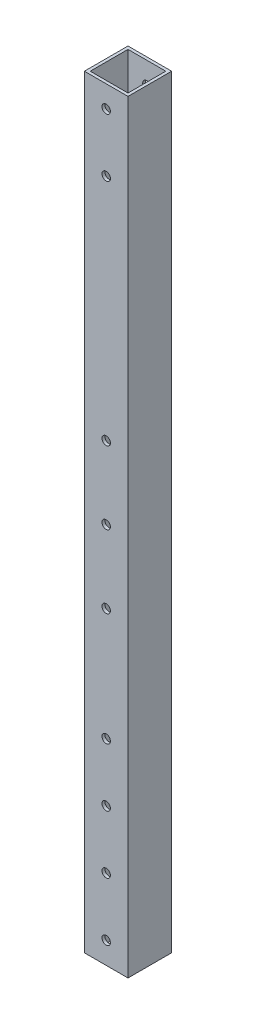
ISO-10303-21;
HEADER;
FILE_DESCRIPTION(('STEP AP214'),'2;1');
FILE_NAME('part.step','',(''),(''),'','','');
FILE_SCHEMA(('AUTOMOTIVE_DESIGN { 1 0 10303 214 1 1 1 1 }'));
ENDSEC;
DATA;
#1=APPLICATION_CONTEXT('core data for automotive mechanical design processes');
#2=APPLICATION_PROTOCOL_DEFINITION('international standard','automotive_design',2000,#1);
#3=PRODUCT_CONTEXT('',#1,'mechanical');
#4=PRODUCT('Part','Part','',(#3));
#5=PRODUCT_RELATED_PRODUCT_CATEGORY('part','',(#4));
#6=PRODUCT_DEFINITION_FORMATION('','',#4);
#7=PRODUCT_DEFINITION_CONTEXT('part definition',#1,'design');
#8=PRODUCT_DEFINITION('design','',#6,#7);
#9=PRODUCT_DEFINITION_SHAPE('','',#8);
#10=(LENGTH_UNIT() NAMED_UNIT(*) SI_UNIT(.MILLI.,.METRE.));
#11=(NAMED_UNIT(*) PLANE_ANGLE_UNIT() SI_UNIT($,.RADIAN.));
#12=(NAMED_UNIT(*) SI_UNIT($,.STERADIAN.) SOLID_ANGLE_UNIT());
#13=UNCERTAINTY_MEASURE_WITH_UNIT(LENGTH_MEASURE(1.E-05),#10,'distance_accuracy_value','');
#14=(GEOMETRIC_REPRESENTATION_CONTEXT(3) GLOBAL_UNCERTAINTY_ASSIGNED_CONTEXT((#13)) GLOBAL_UNIT_ASSIGNED_CONTEXT((#10,
#11,#12)) REPRESENTATION_CONTEXT('',''));
#15=CARTESIAN_POINT('',(0.,0.,0.));
#16=DIRECTION('',(0.,0.,1.));
#17=DIRECTION('',(1.,0.,0.));
#18=AXIS2_PLACEMENT_3D('',#15,#16,#17);
#19=CARTESIAN_POINT('',(0.,262.5,0.));
#20=DIRECTION('',(0.,1.,0.));
#21=DIRECTION('',(0.,0.,1.));
#22=AXIS2_PLACEMENT_3D('',#19,#20,#21);
#23=PLANE('',#22);
#24=DIRECTION('',(0.,0.,-1.));
#25=VECTOR('',#24,1.);
#26=CARTESIAN_POINT('',(7.5,262.5,7.5));
#27=LINE('',#26,#25);
#28=CARTESIAN_POINT('',(7.5,262.5,7.5));
#29=VERTEX_POINT('',#28);
#30=CARTESIAN_POINT('',(7.5,262.5,-7.5));
#31=VERTEX_POINT('',#30);
#32=EDGE_CURVE('E171',#29,#31,#27,.T.);
#33=ORIENTED_EDGE('',*,*,#32,.T.);
#34=DIRECTION('',(-1.,0.,0.));
#35=VECTOR('',#34,1.);
#36=CARTESIAN_POINT('',(-7.5,262.5,-7.5));
#37=LINE('',#36,#35);
#38=CARTESIAN_POINT('',(-7.5,262.5,-7.5));
#39=VERTEX_POINT('',#38);
#40=EDGE_CURVE('E174',#31,#39,#37,.T.);
#41=ORIENTED_EDGE('',*,*,#40,.T.);
#42=DIRECTION('',(0.,0.,1.));
#43=VECTOR('',#42,1.);
#44=CARTESIAN_POINT('',(-7.5,262.5,7.5));
#45=LINE('',#44,#43);
#46=CARTESIAN_POINT('',(-7.5,262.5,7.5));
#47=VERTEX_POINT('',#46);
#48=EDGE_CURVE('E177',#39,#47,#45,.T.);
#49=ORIENTED_EDGE('',*,*,#48,.T.);
#50=DIRECTION('',(1.,0.,0.));
#51=VECTOR('',#50,1.);
#52=CARTESIAN_POINT('',(-7.5,262.5,7.5));
#53=LINE('',#52,#51);
#54=EDGE_CURVE('E179',#47,#29,#53,.T.);
#55=ORIENTED_EDGE('',*,*,#54,.T.);
#56=EDGE_LOOP('',(#33,#41,#49,#55));
#57=FACE_BOUND('',#56,.T.);
#58=DIRECTION('',(-1.,0.,0.));
#59=VECTOR('',#58,1.);
#60=CARTESIAN_POINT('',(0.,262.5,-6.5));
#61=LINE('',#60,#59);
#62=CARTESIAN_POINT('',(6.5,262.5,-6.5));
#63=VERTEX_POINT('',#62);
#64=CARTESIAN_POINT('',(-6.5,262.5,-6.5));
#65=VERTEX_POINT('',#64);
#66=EDGE_CURVE('E141',#63,#65,#61,.T.);
#67=ORIENTED_EDGE('',*,*,#66,.F.);
#68=DIRECTION('',(0.,0.,-1.));
#69=VECTOR('',#68,1.);
#70=CARTESIAN_POINT('',(6.5,262.5,0.));
#71=LINE('',#70,#69);
#72=CARTESIAN_POINT('',(6.5,262.5,6.5));
#73=VERTEX_POINT('',#72);
#74=EDGE_CURVE('E133',#73,#63,#71,.T.);
#75=ORIENTED_EDGE('',*,*,#74,.F.);
#76=DIRECTION('',(1.,0.,0.));
#77=VECTOR('',#76,1.);
#78=CARTESIAN_POINT('',(0.,262.5,6.5));
#79=LINE('',#78,#77);
#80=CARTESIAN_POINT('',(-6.5,262.5,6.5));
#81=VERTEX_POINT('',#80);
#82=EDGE_CURVE('E155',#81,#73,#79,.T.);
#83=ORIENTED_EDGE('',*,*,#82,.F.);
#84=DIRECTION('',(0.,0.,1.));
#85=VECTOR('',#84,1.);
#86=CARTESIAN_POINT('',(-6.5,262.5,0.));
#87=LINE('',#86,#85);
#88=EDGE_CURVE('E153',#65,#81,#87,.T.);
#89=ORIENTED_EDGE('',*,*,#88,.F.);
#90=EDGE_LOOP('',(#67,#75,#83,#89));
#91=FACE_BOUND('',#90,.T.);
#92=ADVANCED_FACE('F66',(#57,#91),#23,.T.);
#93=CARTESIAN_POINT('',(0.,0.,0.));
#94=DIRECTION('',(0.,1.,0.));
#95=DIRECTION('',(0.,0.,1.));
#96=AXIS2_PLACEMENT_3D('',#93,#94,#95);
#97=PLANE('',#96);
#98=DIRECTION('',(0.,0.,-1.));
#99=VECTOR('',#98,1.);
#100=CARTESIAN_POINT('',(7.5,0.,7.5));
#101=LINE('',#100,#99);
#102=CARTESIAN_POINT('',(7.5,0.,7.5));
#103=VERTEX_POINT('',#102);
#104=CARTESIAN_POINT('',(7.5,0.,-7.5));
#105=VERTEX_POINT('',#104);
#106=EDGE_CURVE('E149',#103,#105,#101,.T.);
#107=ORIENTED_EDGE('',*,*,#106,.F.);
#108=DIRECTION('',(1.,0.,0.));
#109=VECTOR('',#108,1.);
#110=CARTESIAN_POINT('',(-7.5,0.,7.5));
#111=LINE('',#110,#109);
#112=CARTESIAN_POINT('',(-7.5,0.,7.5));
#113=VERTEX_POINT('',#112);
#114=EDGE_CURVE('E175',#113,#103,#111,.T.);
#115=ORIENTED_EDGE('',*,*,#114,.F.);
#116=DIRECTION('',(0.,0.,1.));
#117=VECTOR('',#116,1.);
#118=CARTESIAN_POINT('',(-7.5,0.,7.5));
#119=LINE('',#118,#117);
#120=CARTESIAN_POINT('',(-7.5,0.,-7.5));
#121=VERTEX_POINT('',#120);
#122=EDGE_CURVE('E186',#121,#113,#119,.T.);
#123=ORIENTED_EDGE('',*,*,#122,.F.);
#124=DIRECTION('',(-1.,0.,0.));
#125=VECTOR('',#124,1.);
#126=CARTESIAN_POINT('',(-7.5,0.,-7.5));
#127=LINE('',#126,#125);
#128=EDGE_CURVE('E184',#105,#121,#127,.T.);
#129=ORIENTED_EDGE('',*,*,#128,.F.);
#130=EDGE_LOOP('',(#107,#115,#123,#129));
#131=FACE_BOUND('',#130,.T.);
#132=DIRECTION('',(0.,0.,-1.));
#133=VECTOR('',#132,1.);
#134=CARTESIAN_POINT('',(6.5,0.,0.));
#135=LINE('',#134,#133);
#136=CARTESIAN_POINT('',(6.5,0.,6.5));
#137=VERTEX_POINT('',#136);
#138=CARTESIAN_POINT('',(6.5,0.,-6.5));
#139=VERTEX_POINT('',#138);
#140=EDGE_CURVE('E91',#137,#139,#135,.T.);
#141=ORIENTED_EDGE('',*,*,#140,.T.);
#142=DIRECTION('',(-1.,0.,0.));
#143=VECTOR('',#142,1.);
#144=CARTESIAN_POINT('',(0.,0.,-6.5));
#145=LINE('',#144,#143);
#146=CARTESIAN_POINT('',(-6.5,0.,-6.5));
#147=VERTEX_POINT('',#146);
#148=EDGE_CURVE('E148',#139,#147,#145,.T.);
#149=ORIENTED_EDGE('',*,*,#148,.T.);
#150=DIRECTION('',(0.,0.,1.));
#151=VECTOR('',#150,1.);
#152=CARTESIAN_POINT('',(-6.5,0.,0.));
#153=LINE('',#152,#151);
#154=CARTESIAN_POINT('',(-6.5,0.,6.5));
#155=VERTEX_POINT('',#154);
#156=EDGE_CURVE('E163',#147,#155,#153,.T.);
#157=ORIENTED_EDGE('',*,*,#156,.T.);
#158=DIRECTION('',(1.,0.,0.));
#159=VECTOR('',#158,1.);
#160=CARTESIAN_POINT('',(0.,0.,6.5));
#161=LINE('',#160,#159);
#162=EDGE_CURVE('E142',#155,#137,#161,.T.);
#163=ORIENTED_EDGE('',*,*,#162,.T.);
#164=EDGE_LOOP('',(#141,#149,#157,#163));
#165=FACE_BOUND('',#164,.T.);
#166=ADVANCED_FACE('F268',(#131,#165),#97,.F.);
#167=CARTESIAN_POINT('',(7.5,262.5,7.5));
#168=DIRECTION('',(-1.,0.,0.));
#169=DIRECTION('',(0.,0.,1.));
#170=AXIS2_PLACEMENT_3D('',#167,#168,#169);
#171=PLANE('',#170);
#172=ORIENTED_EDGE('',*,*,#106,.T.);
#173=DIRECTION('',(0.,-1.,0.));
#174=VECTOR('',#173,1.);
#175=CARTESIAN_POINT('',(7.5,262.5,-7.5));
#176=LINE('',#175,#174);
#177=EDGE_CURVE('E12',#31,#105,#176,.T.);
#178=ORIENTED_EDGE('',*,*,#177,.F.);
#179=ORIENTED_EDGE('',*,*,#32,.F.);
#180=DIRECTION('',(0.,-1.,0.));
#181=VECTOR('',#180,1.);
#182=CARTESIAN_POINT('',(7.5,262.5,7.5));
#183=LINE('',#182,#181);
#184=EDGE_CURVE('E181',#29,#103,#183,.T.);
#185=ORIENTED_EDGE('',*,*,#184,.T.);
#186=EDGE_LOOP('',(#172,#178,#179,#185));
#187=FACE_BOUND('',#186,.T.);
#188=ADVANCED_FACE('F68',(#187),#171,.F.);
#189=CARTESIAN_POINT('',(-7.5,262.5,-7.5));
#190=DIRECTION('',(0.,0.,1.));
#191=DIRECTION('',(1.,0.,0.));
#192=AXIS2_PLACEMENT_3D('',#189,#190,#191);
#193=PLANE('',#192);
#194=CARTESIAN_POINT('',(0.,7.5,-7.5));
#195=DIRECTION('',(0.,0.,1.));
#196=DIRECTION('',(1.,0.,0.));
#197=AXIS2_PLACEMENT_3D('',#194,#195,#196);
#198=CIRCLE('',#197,1.45);
#199=CARTESIAN_POINT('',(1.45,7.5,-7.5));
#200=VERTEX_POINT('',#199);
#201=EDGE_CURVE('E200',#200,#200,#198,.T.);
#202=ORIENTED_EDGE('',*,*,#201,.T.);
#203=EDGE_LOOP('',(#202));
#204=FACE_BOUND('',#203,.T.);
#205=CARTESIAN_POINT('',(0.,67.5,-7.5));
#206=DIRECTION('',(0.,0.,1.));
#207=DIRECTION('',(1.,0.,0.));
#208=AXIS2_PLACEMENT_3D('',#205,#206,#207);
#209=CIRCLE('',#208,1.45000000000001);
#210=CARTESIAN_POINT('',(1.45000000000001,67.5,-7.5));
#211=VERTEX_POINT('',#210);
#212=EDGE_CURVE('E308',#211,#211,#209,.T.);
#213=ORIENTED_EDGE('',*,*,#212,.T.);
#214=EDGE_LOOP('',(#213));
#215=FACE_BOUND('',#214,.T.);
#216=CARTESIAN_POINT('',(0.,47.5,-7.5));
#217=DIRECTION('',(0.,0.,1.));
#218=DIRECTION('',(1.,0.,0.));
#219=AXIS2_PLACEMENT_3D('',#216,#217,#218);
#220=CIRCLE('',#219,1.45);
#221=CARTESIAN_POINT('',(1.45,47.5,-7.5));
#222=VERTEX_POINT('',#221);
#223=EDGE_CURVE('E312',#222,#222,#220,.T.);
#224=ORIENTED_EDGE('',*,*,#223,.T.);
#225=EDGE_LOOP('',(#224));
#226=FACE_BOUND('',#225,.T.);
#227=CARTESIAN_POINT('',(0.,156.25,-7.5));
#228=DIRECTION('',(0.,0.,1.));
#229=DIRECTION('',(1.,0.,0.));
#230=AXIS2_PLACEMENT_3D('',#227,#228,#229);
#231=CIRCLE('',#230,1.45);
#232=CARTESIAN_POINT('',(1.45,156.25,-7.5));
#233=VERTEX_POINT('',#232);
#234=EDGE_CURVE('E316',#233,#233,#231,.T.);
#235=ORIENTED_EDGE('',*,*,#234,.T.);
#236=EDGE_LOOP('',(#235));
#237=FACE_BOUND('',#236,.T.);
#238=CARTESIAN_POINT('',(0.,106.25,-7.5));
#239=DIRECTION('',(0.,0.,1.));
#240=DIRECTION('',(1.,0.,0.));
#241=AXIS2_PLACEMENT_3D('',#238,#239,#240);
#242=CIRCLE('',#241,1.45);
#243=CARTESIAN_POINT('',(1.45,106.25,-7.5));
#244=VERTEX_POINT('',#243);
#245=EDGE_CURVE('E320',#244,#244,#242,.T.);
#246=ORIENTED_EDGE('',*,*,#245,.T.);
#247=EDGE_LOOP('',(#246));
#248=FACE_BOUND('',#247,.T.);
#249=CARTESIAN_POINT('',(0.,27.5,-7.5));
#250=DIRECTION('',(0.,0.,1.));
#251=DIRECTION('',(1.,0.,0.));
#252=AXIS2_PLACEMENT_3D('',#249,#250,#251);
#253=CIRCLE('',#252,1.45);
#254=CARTESIAN_POINT('',(1.45,27.5,-7.5));
#255=VERTEX_POINT('',#254);
#256=EDGE_CURVE('E324',#255,#255,#253,.T.);
#257=ORIENTED_EDGE('',*,*,#256,.T.);
#258=EDGE_LOOP('',(#257));
#259=FACE_BOUND('',#258,.T.);
#260=CARTESIAN_POINT('',(0.,235.,-7.5));
#261=DIRECTION('',(0.,0.,1.));
#262=DIRECTION('',(-1.,0.,0.));
#263=AXIS2_PLACEMENT_3D('',#260,#261,#262);
#264=CIRCLE('',#263,1.45);
#265=CARTESIAN_POINT('',(-1.45000000000003,235.,-7.5));
#266=VERTEX_POINT('',#265);
#267=EDGE_CURVE('E328',#266,#266,#264,.T.);
#268=ORIENTED_EDGE('',*,*,#267,.T.);
#269=EDGE_LOOP('',(#268));
#270=FACE_BOUND('',#269,.T.);
#271=CARTESIAN_POINT('',(0.,255.,-7.5));
#272=DIRECTION('',(0.,0.,1.));
#273=DIRECTION('',(-1.,0.,0.));
#274=AXIS2_PLACEMENT_3D('',#271,#272,#273);
#275=CIRCLE('',#274,1.44999999999999);
#276=CARTESIAN_POINT('',(-1.45000000000002,255.,-7.5));
#277=VERTEX_POINT('',#276);
#278=EDGE_CURVE('E332',#277,#277,#275,.T.);
#279=ORIENTED_EDGE('',*,*,#278,.T.);
#280=EDGE_LOOP('',(#279));
#281=FACE_BOUND('',#280,.T.);
#282=CARTESIAN_POINT('',(0.,131.25,-7.5));
#283=DIRECTION('',(0.,0.,1.));
#284=DIRECTION('',(1.,0.,0.));
#285=AXIS2_PLACEMENT_3D('',#282,#283,#284);
#286=CIRCLE('',#285,1.44999999999958);
#287=CARTESIAN_POINT('',(1.44999999999958,131.25,-7.5));
#288=VERTEX_POINT('',#287);
#289=EDGE_CURVE('E336',#288,#288,#286,.T.);
#290=ORIENTED_EDGE('',*,*,#289,.T.);
#291=EDGE_LOOP('',(#290));
#292=FACE_BOUND('',#291,.T.);
#293=ORIENTED_EDGE('',*,*,#128,.T.);
#294=DIRECTION('',(0.,-1.,0.));
#295=VECTOR('',#294,1.);
#296=CARTESIAN_POINT('',(-7.5,262.5,-7.5));
#297=LINE('',#296,#295);
#298=EDGE_CURVE('E75',#39,#121,#297,.T.);
#299=ORIENTED_EDGE('',*,*,#298,.F.);
#300=ORIENTED_EDGE('',*,*,#40,.F.);
#301=ORIENTED_EDGE('',*,*,#177,.T.);
#302=EDGE_LOOP('',(#293,#299,#300,#301));
#303=FACE_BOUND('',#302,.T.);
#304=ADVANCED_FACE('F295',(#204,#215,#226,#237,#248,#259,#270,#281,#292,#303),#193,.F.);
#305=CARTESIAN_POINT('',(-7.5,262.5,7.5));
#306=DIRECTION('',(1.,0.,0.));
#307=DIRECTION('',(0.,0.,-1.));
#308=AXIS2_PLACEMENT_3D('',#305,#306,#307);
#309=PLANE('',#308);
#310=ORIENTED_EDGE('',*,*,#122,.T.);
#311=DIRECTION('',(0.,-1.,0.));
#312=VECTOR('',#311,1.);
#313=CARTESIAN_POINT('',(-7.5,262.5,7.5));
#314=LINE('',#313,#312);
#315=EDGE_CURVE('E191',#47,#113,#314,.T.);
#316=ORIENTED_EDGE('',*,*,#315,.F.);
#317=ORIENTED_EDGE('',*,*,#48,.F.);
#318=ORIENTED_EDGE('',*,*,#298,.T.);
#319=EDGE_LOOP('',(#310,#316,#317,#318));
#320=FACE_BOUND('',#319,.T.);
#321=ADVANCED_FACE('F292',(#320),#309,.F.);
#322=CARTESIAN_POINT('',(-7.5,262.5,7.5));
#323=DIRECTION('',(0.,0.,-1.));
#324=DIRECTION('',(-1.,0.,0.));
#325=AXIS2_PLACEMENT_3D('',#322,#323,#324);
#326=PLANE('',#325);
#327=CARTESIAN_POINT('',(0.,7.5,7.5));
#328=DIRECTION('',(0.,0.,1.));
#329=DIRECTION('',(1.,0.,0.));
#330=AXIS2_PLACEMENT_3D('',#327,#328,#329);
#331=CIRCLE('',#330,1.45);
#332=CARTESIAN_POINT('',(1.45,7.5,7.5));
#333=VERTEX_POINT('',#332);
#334=EDGE_CURVE('E361',#333,#333,#331,.T.);
#335=ORIENTED_EDGE('',*,*,#334,.F.);
#336=EDGE_LOOP('',(#335));
#337=FACE_BOUND('',#336,.T.);
#338=CARTESIAN_POINT('',(0.,67.5,7.5));
#339=DIRECTION('',(0.,0.,1.));
#340=DIRECTION('',(1.,0.,0.));
#341=AXIS2_PLACEMENT_3D('',#338,#339,#340);
#342=CIRCLE('',#341,1.45000000000001);
#343=CARTESIAN_POINT('',(1.45000000000001,67.5,7.5));
#344=VERTEX_POINT('',#343);
#345=EDGE_CURVE('E627',#344,#344,#342,.T.);
#346=ORIENTED_EDGE('',*,*,#345,.F.);
#347=EDGE_LOOP('',(#346));
#348=FACE_BOUND('',#347,.T.);
#349=CARTESIAN_POINT('',(0.,47.5,7.5));
#350=DIRECTION('',(0.,0.,1.));
#351=DIRECTION('',(1.,0.,0.));
#352=AXIS2_PLACEMENT_3D('',#349,#350,#351);
#353=CIRCLE('',#352,1.45);
#354=CARTESIAN_POINT('',(1.45,47.5,7.5));
#355=VERTEX_POINT('',#354);
#356=EDGE_CURVE('E623',#355,#355,#353,.T.);
#357=ORIENTED_EDGE('',*,*,#356,.F.);
#358=EDGE_LOOP('',(#357));
#359=FACE_BOUND('',#358,.T.);
#360=CARTESIAN_POINT('',(0.,156.25,7.5));
#361=DIRECTION('',(0.,0.,1.));
#362=DIRECTION('',(1.,0.,0.));
#363=AXIS2_PLACEMENT_3D('',#360,#361,#362);
#364=CIRCLE('',#363,1.45);
#365=CARTESIAN_POINT('',(1.45,156.25,7.5));
#366=VERTEX_POINT('',#365);
#367=EDGE_CURVE('E619',#366,#366,#364,.T.);
#368=ORIENTED_EDGE('',*,*,#367,.F.);
#369=EDGE_LOOP('',(#368));
#370=FACE_BOUND('',#369,.T.);
#371=CARTESIAN_POINT('',(0.,106.25,7.5));
#372=DIRECTION('',(0.,0.,1.));
#373=DIRECTION('',(1.,0.,0.));
#374=AXIS2_PLACEMENT_3D('',#371,#372,#373);
#375=CIRCLE('',#374,1.45);
#376=CARTESIAN_POINT('',(1.45,106.25,7.5));
#377=VERTEX_POINT('',#376);
#378=EDGE_CURVE('E350',#377,#377,#375,.T.);
#379=ORIENTED_EDGE('',*,*,#378,.F.);
#380=EDGE_LOOP('',(#379));
#381=FACE_BOUND('',#380,.T.);
#382=CARTESIAN_POINT('',(0.,27.5,7.5));
#383=DIRECTION('',(0.,0.,1.));
#384=DIRECTION('',(1.,0.,0.));
#385=AXIS2_PLACEMENT_3D('',#382,#383,#384);
#386=CIRCLE('',#385,1.45);
#387=CARTESIAN_POINT('',(1.45,27.5,7.5));
#388=VERTEX_POINT('',#387);
#389=EDGE_CURVE('E358',#388,#388,#386,.T.);
#390=ORIENTED_EDGE('',*,*,#389,.F.);
#391=EDGE_LOOP('',(#390));
#392=FACE_BOUND('',#391,.T.);
#393=CARTESIAN_POINT('',(0.,235.,7.5));
#394=DIRECTION('',(0.,0.,1.));
#395=DIRECTION('',(-1.,0.,0.));
#396=AXIS2_PLACEMENT_3D('',#393,#394,#395);
#397=CIRCLE('',#396,1.45);
#398=CARTESIAN_POINT('',(-1.45000000000003,235.,7.5));
#399=VERTEX_POINT('',#398);
#400=EDGE_CURVE('E363',#399,#399,#397,.T.);
#401=ORIENTED_EDGE('',*,*,#400,.F.);
#402=EDGE_LOOP('',(#401));
#403=FACE_BOUND('',#402,.T.);
#404=CARTESIAN_POINT('',(0.,255.,7.5));
#405=DIRECTION('',(0.,0.,1.));
#406=DIRECTION('',(-1.,0.,0.));
#407=AXIS2_PLACEMENT_3D('',#404,#405,#406);
#408=CIRCLE('',#407,1.44999999999999);
#409=CARTESIAN_POINT('',(-1.45000000000002,255.,7.5));
#410=VERTEX_POINT('',#409);
#411=EDGE_CURVE('E367',#410,#410,#408,.T.);
#412=ORIENTED_EDGE('',*,*,#411,.F.);
#413=EDGE_LOOP('',(#412));
#414=FACE_BOUND('',#413,.T.);
#415=CARTESIAN_POINT('',(0.,131.25,7.5));
#416=DIRECTION('',(0.,0.,1.));
#417=DIRECTION('',(1.,0.,0.));
#418=AXIS2_PLACEMENT_3D('',#415,#416,#417);
#419=CIRCLE('',#418,1.44999999999958);
#420=CARTESIAN_POINT('',(1.44999999999958,131.25,7.5));
#421=VERTEX_POINT('',#420);
#422=EDGE_CURVE('E349',#421,#421,#419,.T.);
#423=ORIENTED_EDGE('',*,*,#422,.F.);
#424=EDGE_LOOP('',(#423));
#425=FACE_BOUND('',#424,.T.);
#426=ORIENTED_EDGE('',*,*,#114,.T.);
#427=ORIENTED_EDGE('',*,*,#184,.F.);
#428=ORIENTED_EDGE('',*,*,#54,.F.);
#429=ORIENTED_EDGE('',*,*,#315,.T.);
#430=EDGE_LOOP('',(#426,#427,#428,#429));
#431=FACE_BOUND('',#430,.T.);
#432=ADVANCED_FACE('F289',(#337,#348,#359,#370,#381,#392,#403,#414,#425,#431),#326,.F.);
#433=CARTESIAN_POINT('',(6.5,262.5,0.));
#434=DIRECTION('',(-1.,0.,0.));
#435=DIRECTION('',(0.,0.,1.));
#436=AXIS2_PLACEMENT_3D('',#433,#434,#435);
#437=PLANE('',#436);
#438=ORIENTED_EDGE('',*,*,#140,.F.);
#439=DIRECTION('',(0.,-1.,0.));
#440=VECTOR('',#439,1.);
#441=CARTESIAN_POINT('',(6.5,262.5,6.5));
#442=LINE('',#441,#440);
#443=EDGE_CURVE('E137',#73,#137,#442,.T.);
#444=ORIENTED_EDGE('',*,*,#443,.F.);
#445=ORIENTED_EDGE('',*,*,#74,.T.);
#446=DIRECTION('',(0.,-1.,0.));
#447=VECTOR('',#446,1.);
#448=CARTESIAN_POINT('',(6.5,262.5,-6.5));
#449=LINE('',#448,#447);
#450=EDGE_CURVE('E136',#63,#139,#449,.T.);
#451=ORIENTED_EDGE('',*,*,#450,.T.);
#452=EDGE_LOOP('',(#438,#444,#445,#451));
#453=FACE_BOUND('',#452,.T.);
#454=ADVANCED_FACE('F135',(#453),#437,.T.);
#455=CARTESIAN_POINT('',(0.,262.5,-6.5));
#456=DIRECTION('',(0.,0.,1.));
#457=DIRECTION('',(1.,0.,0.));
#458=AXIS2_PLACEMENT_3D('',#455,#456,#457);
#459=PLANE('',#458);
#460=CARTESIAN_POINT('',(0.,7.5,-6.5));
#461=DIRECTION('',(0.,0.,1.));
#462=DIRECTION('',(1.,0.,0.));
#463=AXIS2_PLACEMENT_3D('',#460,#461,#462);
#464=CIRCLE('',#463,1.45);
#465=CARTESIAN_POINT('',(1.45,7.5,-6.5));
#466=VERTEX_POINT('',#465);
#467=EDGE_CURVE('E161',#466,#466,#464,.T.);
#468=ORIENTED_EDGE('',*,*,#467,.F.);
#469=EDGE_LOOP('',(#468));
#470=FACE_BOUND('',#469,.T.);
#471=CARTESIAN_POINT('',(0.,67.5,-6.5));
#472=DIRECTION('',(0.,0.,1.));
#473=DIRECTION('',(1.,0.,0.));
#474=AXIS2_PLACEMENT_3D('',#471,#472,#473);
#475=CIRCLE('',#474,1.45000000000001);
#476=CARTESIAN_POINT('',(1.45000000000001,67.5,-6.5));
#477=VERTEX_POINT('',#476);
#478=EDGE_CURVE('E226',#477,#477,#475,.T.);
#479=ORIENTED_EDGE('',*,*,#478,.F.);
#480=EDGE_LOOP('',(#479));
#481=FACE_BOUND('',#480,.T.);
#482=CARTESIAN_POINT('',(0.,47.5,-6.5));
#483=DIRECTION('',(0.,0.,1.));
#484=DIRECTION('',(1.,0.,0.));
#485=AXIS2_PLACEMENT_3D('',#482,#483,#484);
#486=CIRCLE('',#485,1.45);
#487=CARTESIAN_POINT('',(1.45,47.5,-6.5));
#488=VERTEX_POINT('',#487);
#489=EDGE_CURVE('E223',#488,#488,#486,.T.);
#490=ORIENTED_EDGE('',*,*,#489,.F.);
#491=EDGE_LOOP('',(#490));
#492=FACE_BOUND('',#491,.T.);
#493=CARTESIAN_POINT('',(0.,156.25,-6.5));
#494=DIRECTION('',(0.,0.,1.));
#495=DIRECTION('',(1.,0.,0.));
#496=AXIS2_PLACEMENT_3D('',#493,#494,#495);
#497=CIRCLE('',#496,1.45);
#498=CARTESIAN_POINT('',(1.45,156.25,-6.5));
#499=VERTEX_POINT('',#498);
#500=EDGE_CURVE('E220',#499,#499,#497,.T.);
#501=ORIENTED_EDGE('',*,*,#500,.F.);
#502=EDGE_LOOP('',(#501));
#503=FACE_BOUND('',#502,.T.);
#504=CARTESIAN_POINT('',(0.,106.25,-6.5));
#505=DIRECTION('',(0.,0.,1.));
#506=DIRECTION('',(1.,0.,0.));
#507=AXIS2_PLACEMENT_3D('',#504,#505,#506);
#508=CIRCLE('',#507,1.45);
#509=CARTESIAN_POINT('',(1.45,106.25,-6.5));
#510=VERTEX_POINT('',#509);
#511=EDGE_CURVE('E216',#510,#510,#508,.T.);
#512=ORIENTED_EDGE('',*,*,#511,.F.);
#513=EDGE_LOOP('',(#512));
#514=FACE_BOUND('',#513,.T.);
#515=CARTESIAN_POINT('',(0.,27.5,-6.5));
#516=DIRECTION('',(0.,0.,1.));
#517=DIRECTION('',(1.,0.,0.));
#518=AXIS2_PLACEMENT_3D('',#515,#516,#517);
#519=CIRCLE('',#518,1.45);
#520=CARTESIAN_POINT('',(1.45,27.5,-6.5));
#521=VERTEX_POINT('',#520);
#522=EDGE_CURVE('E212',#521,#521,#519,.T.);
#523=ORIENTED_EDGE('',*,*,#522,.F.);
#524=EDGE_LOOP('',(#523));
#525=FACE_BOUND('',#524,.T.);
#526=CARTESIAN_POINT('',(0.,235.,-6.5));
#527=DIRECTION('',(0.,0.,1.));
#528=DIRECTION('',(1.,0.,0.));
#529=AXIS2_PLACEMENT_3D('',#526,#527,#528);
#530=CIRCLE('',#529,1.45);
#531=CARTESIAN_POINT('',(1.44999999999998,235.,-6.5));
#532=VERTEX_POINT('',#531);
#533=EDGE_CURVE('E208',#532,#532,#530,.T.);
#534=ORIENTED_EDGE('',*,*,#533,.F.);
#535=EDGE_LOOP('',(#534));
#536=FACE_BOUND('',#535,.T.);
#537=CARTESIAN_POINT('',(0.,255.,-6.5));
#538=DIRECTION('',(0.,0.,1.));
#539=DIRECTION('',(1.,0.,0.));
#540=AXIS2_PLACEMENT_3D('',#537,#538,#539);
#541=CIRCLE('',#540,1.44999999999999);
#542=CARTESIAN_POINT('',(1.44999999999996,255.,-6.5));
#543=VERTEX_POINT('',#542);
#544=EDGE_CURVE('E204',#543,#543,#541,.T.);
#545=ORIENTED_EDGE('',*,*,#544,.F.);
#546=EDGE_LOOP('',(#545));
#547=FACE_BOUND('',#546,.T.);
#548=CARTESIAN_POINT('',(0.,131.25,-6.5));
#549=DIRECTION('',(0.,0.,1.));
#550=DIRECTION('',(1.,0.,0.));
#551=AXIS2_PLACEMENT_3D('',#548,#549,#550);
#552=CIRCLE('',#551,1.44999999999958);
#553=CARTESIAN_POINT('',(1.44999999999958,131.25,-6.5));
#554=VERTEX_POINT('',#553);
#555=EDGE_CURVE('E199',#554,#554,#552,.T.);
#556=ORIENTED_EDGE('',*,*,#555,.F.);
#557=EDGE_LOOP('',(#556));
#558=FACE_BOUND('',#557,.T.);
#559=ORIENTED_EDGE('',*,*,#148,.F.);
#560=ORIENTED_EDGE('',*,*,#450,.F.);
#561=ORIENTED_EDGE('',*,*,#66,.T.);
#562=DIRECTION('',(0.,-1.,0.));
#563=VECTOR('',#562,1.);
#564=CARTESIAN_POINT('',(-6.5,262.5,-6.5));
#565=LINE('',#564,#563);
#566=EDGE_CURVE('E150',#65,#147,#565,.T.);
#567=ORIENTED_EDGE('',*,*,#566,.T.);
#568=EDGE_LOOP('',(#559,#560,#561,#567));
#569=FACE_BOUND('',#568,.T.);
#570=ADVANCED_FACE('F145',(#470,#481,#492,#503,#514,#525,#536,#547,#558,#569),#459,.T.);
#571=CARTESIAN_POINT('',(-6.5,262.5,0.));
#572=DIRECTION('',(1.,0.,0.));
#573=DIRECTION('',(0.,0.,-1.));
#574=AXIS2_PLACEMENT_3D('',#571,#572,#573);
#575=PLANE('',#574);
#576=ORIENTED_EDGE('',*,*,#156,.F.);
#577=ORIENTED_EDGE('',*,*,#566,.F.);
#578=ORIENTED_EDGE('',*,*,#88,.T.);
#579=DIRECTION('',(0.,-1.,0.));
#580=VECTOR('',#579,1.);
#581=CARTESIAN_POINT('',(-6.5,262.5,6.5));
#582=LINE('',#581,#580);
#583=EDGE_CURVE('E83',#81,#155,#582,.T.);
#584=ORIENTED_EDGE('',*,*,#583,.T.);
#585=EDGE_LOOP('',(#576,#577,#578,#584));
#586=FACE_BOUND('',#585,.T.);
#587=ADVANCED_FACE('F250',(#586),#575,.T.);
#588=CARTESIAN_POINT('',(0.,262.5,6.5));
#589=DIRECTION('',(0.,0.,-1.));
#590=DIRECTION('',(-1.,0.,0.));
#591=AXIS2_PLACEMENT_3D('',#588,#589,#590);
#592=PLANE('',#591);
#593=CARTESIAN_POINT('',(0.,7.5,6.5));
#594=DIRECTION('',(0.,0.,-1.));
#595=DIRECTION('',(-1.,0.,0.));
#596=AXIS2_PLACEMENT_3D('',#593,#594,#595);
#597=CIRCLE('',#596,1.45);
#598=CARTESIAN_POINT('',(-1.45,7.5,6.5));
#599=VERTEX_POINT('',#598);
#600=EDGE_CURVE('E70',#599,#599,#597,.T.);
#601=ORIENTED_EDGE('',*,*,#600,.F.);
#602=EDGE_LOOP('',(#601));
#603=FACE_BOUND('',#602,.T.);
#604=CARTESIAN_POINT('',(0.,67.5,6.5));
#605=DIRECTION('',(0.,0.,-1.));
#606=DIRECTION('',(-1.,0.,0.));
#607=AXIS2_PLACEMENT_3D('',#604,#605,#606);
#608=CIRCLE('',#607,1.45000000000001);
#609=CARTESIAN_POINT('',(-1.45000000000001,67.5,6.5));
#610=VERTEX_POINT('',#609);
#611=EDGE_CURVE('E224',#610,#610,#608,.T.);
#612=ORIENTED_EDGE('',*,*,#611,.F.);
#613=EDGE_LOOP('',(#612));
#614=FACE_BOUND('',#613,.T.);
#615=CARTESIAN_POINT('',(0.,47.5,6.5));
#616=DIRECTION('',(0.,0.,-1.));
#617=DIRECTION('',(-1.,0.,0.));
#618=AXIS2_PLACEMENT_3D('',#615,#616,#617);
#619=CIRCLE('',#618,1.45);
#620=CARTESIAN_POINT('',(-1.45,47.5,6.5));
#621=VERTEX_POINT('',#620);
#622=EDGE_CURVE('E221',#621,#621,#619,.T.);
#623=ORIENTED_EDGE('',*,*,#622,.F.);
#624=EDGE_LOOP('',(#623));
#625=FACE_BOUND('',#624,.T.);
#626=CARTESIAN_POINT('',(0.,156.25,6.5));
#627=DIRECTION('',(0.,0.,-1.));
#628=DIRECTION('',(-1.,0.,0.));
#629=AXIS2_PLACEMENT_3D('',#626,#627,#628);
#630=CIRCLE('',#629,1.45);
#631=CARTESIAN_POINT('',(-1.45,156.25,6.5));
#632=VERTEX_POINT('',#631);
#633=EDGE_CURVE('E217',#632,#632,#630,.T.);
#634=ORIENTED_EDGE('',*,*,#633,.F.);
#635=EDGE_LOOP('',(#634));
#636=FACE_BOUND('',#635,.T.);
#637=CARTESIAN_POINT('',(0.,106.25,6.5));
#638=DIRECTION('',(0.,0.,-1.));
#639=DIRECTION('',(-1.,0.,0.));
#640=AXIS2_PLACEMENT_3D('',#637,#638,#639);
#641=CIRCLE('',#640,1.45);
#642=CARTESIAN_POINT('',(-1.45,106.25,6.5));
#643=VERTEX_POINT('',#642);
#644=EDGE_CURVE('E213',#643,#643,#641,.T.);
#645=ORIENTED_EDGE('',*,*,#644,.F.);
#646=EDGE_LOOP('',(#645));
#647=FACE_BOUND('',#646,.T.);
#648=CARTESIAN_POINT('',(0.,27.5,6.5));
#649=DIRECTION('',(0.,0.,-1.));
#650=DIRECTION('',(-1.,0.,0.));
#651=AXIS2_PLACEMENT_3D('',#648,#649,#650);
#652=CIRCLE('',#651,1.45);
#653=CARTESIAN_POINT('',(-1.45,27.5,6.5));
#654=VERTEX_POINT('',#653);
#655=EDGE_CURVE('E209',#654,#654,#652,.T.);
#656=ORIENTED_EDGE('',*,*,#655,.F.);
#657=EDGE_LOOP('',(#656));
#658=FACE_BOUND('',#657,.T.);
#659=CARTESIAN_POINT('',(0.,235.,6.5));
#660=DIRECTION('',(0.,0.,-1.));
#661=DIRECTION('',(-1.,0.,0.));
#662=AXIS2_PLACEMENT_3D('',#659,#660,#661);
#663=CIRCLE('',#662,1.45);
#664=CARTESIAN_POINT('',(-1.45000000000003,235.,6.5));
#665=VERTEX_POINT('',#664);
#666=EDGE_CURVE('E205',#665,#665,#663,.T.);
#667=ORIENTED_EDGE('',*,*,#666,.F.);
#668=EDGE_LOOP('',(#667));
#669=FACE_BOUND('',#668,.T.);
#670=CARTESIAN_POINT('',(0.,255.,6.5));
#671=DIRECTION('',(0.,0.,-1.));
#672=DIRECTION('',(-1.,0.,0.));
#673=AXIS2_PLACEMENT_3D('',#670,#671,#672);
#674=CIRCLE('',#673,1.44999999999999);
#675=CARTESIAN_POINT('',(-1.45000000000002,255.,6.5));
#676=VERTEX_POINT('',#675);
#677=EDGE_CURVE('E201',#676,#676,#674,.T.);
#678=ORIENTED_EDGE('',*,*,#677,.F.);
#679=EDGE_LOOP('',(#678));
#680=FACE_BOUND('',#679,.T.);
#681=CARTESIAN_POINT('',(0.,131.25,6.5));
#682=DIRECTION('',(0.,0.,-1.));
#683=DIRECTION('',(-1.,0.,0.));
#684=AXIS2_PLACEMENT_3D('',#681,#682,#683);
#685=CIRCLE('',#684,1.44999999999958);
#686=CARTESIAN_POINT('',(-1.44999999999958,131.25,6.5));
#687=VERTEX_POINT('',#686);
#688=EDGE_CURVE('E196',#687,#687,#685,.T.);
#689=ORIENTED_EDGE('',*,*,#688,.F.);
#690=EDGE_LOOP('',(#689));
#691=FACE_BOUND('',#690,.T.);
#692=ORIENTED_EDGE('',*,*,#162,.F.);
#693=ORIENTED_EDGE('',*,*,#583,.F.);
#694=ORIENTED_EDGE('',*,*,#82,.T.);
#695=ORIENTED_EDGE('',*,*,#443,.T.);
#696=EDGE_LOOP('',(#692,#693,#694,#695));
#697=FACE_BOUND('',#696,.T.);
#698=ADVANCED_FACE('F246',(#603,#614,#625,#636,#647,#658,#669,#680,#691,#697),#592,.T.);
#699=CARTESIAN_POINT('',(0.,131.25,-7.5));
#700=DIRECTION('',(0.,0.,1.));
#701=DIRECTION('',(1.,0.,0.));
#702=AXIS2_PLACEMENT_3D('',#699,#700,#701);
#703=CYLINDRICAL_SURFACE('',#702,1.44999999999958);
#704=ORIENTED_EDGE('',*,*,#688,.T.);
#705=EDGE_LOOP('',(#704));
#706=FACE_BOUND('',#705,.T.);
#707=ORIENTED_EDGE('',*,*,#422,.T.);
#708=EDGE_LOOP('',(#707));
#709=FACE_BOUND('',#708,.T.);
#710=ADVANCED_FACE('F249',(#706,#709),#703,.F.);
#711=CARTESIAN_POINT('',(0.,255.,-7.5));
#712=DIRECTION('',(0.,0.,1.));
#713=DIRECTION('',(1.,0.,0.));
#714=AXIS2_PLACEMENT_3D('',#711,#712,#713);
#715=CYLINDRICAL_SURFACE('',#714,1.44999999999999);
#716=ORIENTED_EDGE('',*,*,#677,.T.);
#717=EDGE_LOOP('',(#716));
#718=FACE_BOUND('',#717,.T.);
#719=ORIENTED_EDGE('',*,*,#411,.T.);
#720=EDGE_LOOP('',(#719));
#721=FACE_BOUND('',#720,.T.);
#722=ADVANCED_FACE('F401',(#718,#721),#715,.F.);
#723=CARTESIAN_POINT('',(0.,235.,-7.5));
#724=DIRECTION('',(0.,0.,1.));
#725=DIRECTION('',(1.,0.,0.));
#726=AXIS2_PLACEMENT_3D('',#723,#724,#725);
#727=CYLINDRICAL_SURFACE('',#726,1.45);
#728=ORIENTED_EDGE('',*,*,#666,.T.);
#729=EDGE_LOOP('',(#728));
#730=FACE_BOUND('',#729,.T.);
#731=ORIENTED_EDGE('',*,*,#400,.T.);
#732=EDGE_LOOP('',(#731));
#733=FACE_BOUND('',#732,.T.);
#734=ADVANCED_FACE('F411',(#730,#733),#727,.F.);
#735=CARTESIAN_POINT('',(0.,27.5,-7.5));
#736=DIRECTION('',(0.,0.,1.));
#737=DIRECTION('',(1.,0.,0.));
#738=AXIS2_PLACEMENT_3D('',#735,#736,#737);
#739=CYLINDRICAL_SURFACE('',#738,1.45);
#740=ORIENTED_EDGE('',*,*,#655,.T.);
#741=EDGE_LOOP('',(#740));
#742=FACE_BOUND('',#741,.T.);
#743=ORIENTED_EDGE('',*,*,#389,.T.);
#744=EDGE_LOOP('',(#743));
#745=FACE_BOUND('',#744,.T.);
#746=ADVANCED_FACE('F419',(#742,#745),#739,.F.);
#747=CARTESIAN_POINT('',(0.,106.25,-7.5));
#748=DIRECTION('',(0.,0.,1.));
#749=DIRECTION('',(1.,0.,0.));
#750=AXIS2_PLACEMENT_3D('',#747,#748,#749);
#751=CYLINDRICAL_SURFACE('',#750,1.45);
#752=ORIENTED_EDGE('',*,*,#644,.T.);
#753=EDGE_LOOP('',(#752));
#754=FACE_BOUND('',#753,.T.);
#755=ORIENTED_EDGE('',*,*,#378,.T.);
#756=EDGE_LOOP('',(#755));
#757=FACE_BOUND('',#756,.T.);
#758=ADVANCED_FACE('F435',(#754,#757),#751,.F.);
#759=CARTESIAN_POINT('',(0.,156.25,-7.5));
#760=DIRECTION('',(0.,0.,1.));
#761=DIRECTION('',(1.,0.,0.));
#762=AXIS2_PLACEMENT_3D('',#759,#760,#761);
#763=CYLINDRICAL_SURFACE('',#762,1.45);
#764=ORIENTED_EDGE('',*,*,#633,.T.);
#765=EDGE_LOOP('',(#764));
#766=FACE_BOUND('',#765,.T.);
#767=ORIENTED_EDGE('',*,*,#367,.T.);
#768=EDGE_LOOP('',(#767));
#769=FACE_BOUND('',#768,.T.);
#770=ADVANCED_FACE('F430',(#766,#769),#763,.F.);
#771=CARTESIAN_POINT('',(0.,47.5,-7.5));
#772=DIRECTION('',(0.,0.,1.));
#773=DIRECTION('',(1.,0.,0.));
#774=AXIS2_PLACEMENT_3D('',#771,#772,#773);
#775=CYLINDRICAL_SURFACE('',#774,1.45);
#776=ORIENTED_EDGE('',*,*,#622,.T.);
#777=EDGE_LOOP('',(#776));
#778=FACE_BOUND('',#777,.T.);
#779=ORIENTED_EDGE('',*,*,#356,.T.);
#780=EDGE_LOOP('',(#779));
#781=FACE_BOUND('',#780,.T.);
#782=ADVANCED_FACE('F426',(#778,#781),#775,.F.);
#783=CARTESIAN_POINT('',(0.,67.5,-7.5));
#784=DIRECTION('',(0.,0.,1.));
#785=DIRECTION('',(1.,0.,0.));
#786=AXIS2_PLACEMENT_3D('',#783,#784,#785);
#787=CYLINDRICAL_SURFACE('',#786,1.45000000000001);
#788=ORIENTED_EDGE('',*,*,#611,.T.);
#789=EDGE_LOOP('',(#788));
#790=FACE_BOUND('',#789,.T.);
#791=ORIENTED_EDGE('',*,*,#345,.T.);
#792=EDGE_LOOP('',(#791));
#793=FACE_BOUND('',#792,.T.);
#794=ADVANCED_FACE('F402',(#790,#793),#787,.F.);
#795=CARTESIAN_POINT('',(0.,7.5,-7.5));
#796=DIRECTION('',(0.,0.,1.));
#797=DIRECTION('',(1.,0.,0.));
#798=AXIS2_PLACEMENT_3D('',#795,#796,#797);
#799=CYLINDRICAL_SURFACE('',#798,1.45);
#800=ORIENTED_EDGE('',*,*,#600,.T.);
#801=EDGE_LOOP('',(#800));
#802=FACE_BOUND('',#801,.T.);
#803=ORIENTED_EDGE('',*,*,#334,.T.);
#804=EDGE_LOOP('',(#803));
#805=FACE_BOUND('',#804,.T.);
#806=ADVANCED_FACE('F243',(#802,#805),#799,.F.);
#807=ORIENTED_EDGE('',*,*,#555,.T.);
#808=EDGE_LOOP('',(#807));
#809=FACE_BOUND('',#808,.T.);
#810=ORIENTED_EDGE('',*,*,#289,.F.);
#811=EDGE_LOOP('',(#810));
#812=FACE_BOUND('',#811,.T.);
#813=ADVANCED_FACE('F390',(#809,#812),#703,.F.);
#814=ORIENTED_EDGE('',*,*,#544,.T.);
#815=EDGE_LOOP('',(#814));
#816=FACE_BOUND('',#815,.T.);
#817=ORIENTED_EDGE('',*,*,#278,.F.);
#818=EDGE_LOOP('',(#817));
#819=FACE_BOUND('',#818,.T.);
#820=ADVANCED_FACE('F392',(#816,#819),#715,.F.);
#821=ORIENTED_EDGE('',*,*,#533,.T.);
#822=EDGE_LOOP('',(#821));
#823=FACE_BOUND('',#822,.T.);
#824=ORIENTED_EDGE('',*,*,#267,.F.);
#825=EDGE_LOOP('',(#824));
#826=FACE_BOUND('',#825,.T.);
#827=ADVANCED_FACE('F398',(#823,#826),#727,.F.);
#828=ORIENTED_EDGE('',*,*,#522,.T.);
#829=EDGE_LOOP('',(#828));
#830=FACE_BOUND('',#829,.T.);
#831=ORIENTED_EDGE('',*,*,#256,.F.);
#832=EDGE_LOOP('',(#831));
#833=FACE_BOUND('',#832,.T.);
#834=ADVANCED_FACE('F444',(#830,#833),#739,.F.);
#835=ORIENTED_EDGE('',*,*,#511,.T.);
#836=EDGE_LOOP('',(#835));
#837=FACE_BOUND('',#836,.T.);
#838=ORIENTED_EDGE('',*,*,#245,.F.);
#839=EDGE_LOOP('',(#838));
#840=FACE_BOUND('',#839,.T.);
#841=ADVANCED_FACE('F378',(#837,#840),#751,.F.);
#842=ORIENTED_EDGE('',*,*,#500,.T.);
#843=EDGE_LOOP('',(#842));
#844=FACE_BOUND('',#843,.T.);
#845=ORIENTED_EDGE('',*,*,#234,.F.);
#846=EDGE_LOOP('',(#845));
#847=FACE_BOUND('',#846,.T.);
#848=ADVANCED_FACE('F437',(#844,#847),#763,.F.);
#849=ORIENTED_EDGE('',*,*,#489,.T.);
#850=EDGE_LOOP('',(#849));
#851=FACE_BOUND('',#850,.T.);
#852=ORIENTED_EDGE('',*,*,#223,.F.);
#853=EDGE_LOOP('',(#852));
#854=FACE_BOUND('',#853,.T.);
#855=ADVANCED_FACE('F432',(#851,#854),#775,.F.);
#856=ORIENTED_EDGE('',*,*,#478,.T.);
#857=EDGE_LOOP('',(#856));
#858=FACE_BOUND('',#857,.T.);
#859=ORIENTED_EDGE('',*,*,#212,.F.);
#860=EDGE_LOOP('',(#859));
#861=FACE_BOUND('',#860,.T.);
#862=ADVANCED_FACE('F427',(#858,#861),#787,.F.);
#863=ORIENTED_EDGE('',*,*,#467,.T.);
#864=EDGE_LOOP('',(#863));
#865=FACE_BOUND('',#864,.T.);
#866=ORIENTED_EDGE('',*,*,#201,.F.);
#867=EDGE_LOOP('',(#866));
#868=FACE_BOUND('',#867,.T.);
#869=ADVANCED_FACE('F404',(#865,#868),#799,.F.);
#870=CLOSED_SHELL('',(#92,#166,#188,#304,#321,#432,#454,#570,#587,#698,#710,#722,#734,#746,#758,
#770,#782,#794,#806,#813,#820,#827,#834,#841,#848,#855,#862,#869));
#871=MANIFOLD_SOLID_BREP('B2',#870);
#872=ADVANCED_BREP_SHAPE_REPRESENTATION('',(#18,#871),#14);
#873=SHAPE_DEFINITION_REPRESENTATION(#9,#872);
ENDSEC;
END-ISO-10303-21;
